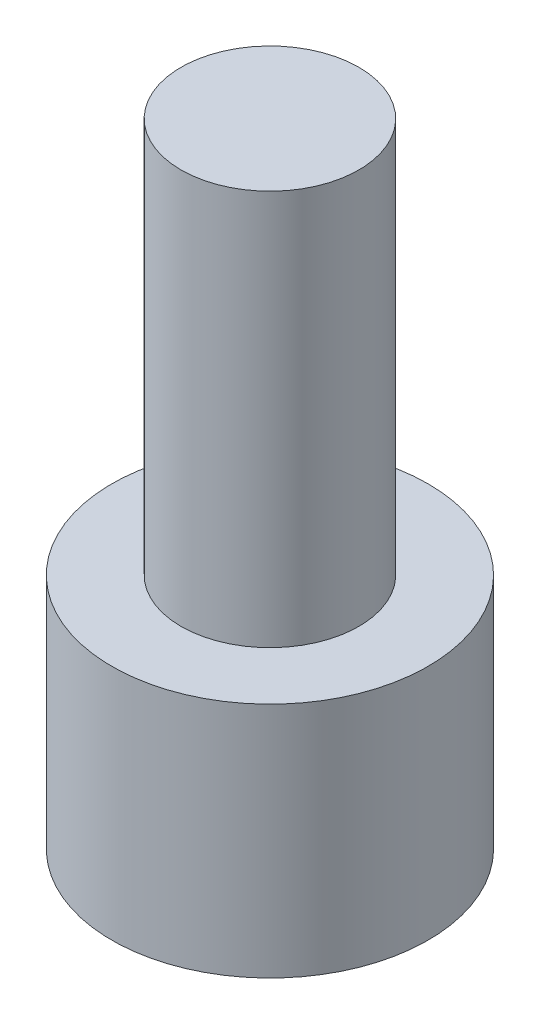
ISO-10303-21;
HEADER;
FILE_DESCRIPTION(('STEP AP214'),'2;1');
FILE_NAME('part.step','',(''),(''),'','','');
FILE_SCHEMA(('AUTOMOTIVE_DESIGN { 1 0 10303 214 1 1 1 1 }'));
ENDSEC;
DATA;
#1=APPLICATION_CONTEXT('core data for automotive mechanical design processes');
#2=APPLICATION_PROTOCOL_DEFINITION('international standard','automotive_design',2000,#1);
#3=PRODUCT_CONTEXT('',#1,'mechanical');
#4=PRODUCT('Part','Part','',(#3));
#5=PRODUCT_RELATED_PRODUCT_CATEGORY('part','',(#4));
#6=PRODUCT_DEFINITION_FORMATION('','',#4);
#7=PRODUCT_DEFINITION_CONTEXT('part definition',#1,'design');
#8=PRODUCT_DEFINITION('design','',#6,#7);
#9=PRODUCT_DEFINITION_SHAPE('','',#8);
#10=(LENGTH_UNIT() NAMED_UNIT(*) SI_UNIT(.MILLI.,.METRE.));
#11=(NAMED_UNIT(*) PLANE_ANGLE_UNIT() SI_UNIT($,.RADIAN.));
#12=(NAMED_UNIT(*) SI_UNIT($,.STERADIAN.) SOLID_ANGLE_UNIT());
#13=UNCERTAINTY_MEASURE_WITH_UNIT(LENGTH_MEASURE(1.E-05),#10,'distance_accuracy_value','');
#14=(GEOMETRIC_REPRESENTATION_CONTEXT(3) GLOBAL_UNCERTAINTY_ASSIGNED_CONTEXT((#13)) GLOBAL_UNIT_ASSIGNED_CONTEXT((#10,
#11,#12)) REPRESENTATION_CONTEXT('',''));
#15=CARTESIAN_POINT('',(0.,0.,0.));
#16=DIRECTION('',(0.,0.,1.));
#17=DIRECTION('',(1.,0.,0.));
#18=AXIS2_PLACEMENT_3D('',#15,#16,#17);
#19=CARTESIAN_POINT('',(0.,10.,0.));
#20=DIRECTION('',(0.,-1.,0.));
#21=DIRECTION('',(0.,0.,-1.));
#22=AXIS2_PLACEMENT_3D('',#19,#20,#21);
#23=CYLINDRICAL_SURFACE('',#22,2.25);
#24=CARTESIAN_POINT('',(0.,10.,0.));
#25=DIRECTION('',(0.,1.,0.));
#26=DIRECTION('',(0.,0.,1.));
#27=AXIS2_PLACEMENT_3D('',#24,#25,#26);
#28=CIRCLE('',#27,2.25);
#29=CARTESIAN_POINT('',(0.,10.,2.25));
#30=VERTEX_POINT('',#29);
#31=EDGE_CURVE('E10',#30,#30,#28,.T.);
#32=ORIENTED_EDGE('',*,*,#31,.F.);
#33=EDGE_LOOP('',(#32));
#34=FACE_BOUND('',#33,.T.);
#35=CARTESIAN_POINT('',(0.,0.,0.));
#36=DIRECTION('',(0.,1.,0.));
#37=DIRECTION('',(0.,0.,1.));
#38=AXIS2_PLACEMENT_3D('',#35,#36,#37);
#39=CIRCLE('',#38,2.25);
#40=CARTESIAN_POINT('',(0.,0.,2.25));
#41=VERTEX_POINT('',#40);
#42=EDGE_CURVE('E38',#41,#41,#39,.T.);
#43=ORIENTED_EDGE('',*,*,#42,.T.);
#44=EDGE_LOOP('',(#43));
#45=FACE_BOUND('',#44,.T.);
#46=ADVANCED_FACE('F35',(#34,#45),#23,.T.);
#47=CARTESIAN_POINT('',(0.,10.,0.));
#48=DIRECTION('',(0.,1.,0.));
#49=DIRECTION('',(0.,0.,1.));
#50=AXIS2_PLACEMENT_3D('',#47,#48,#49);
#51=PLANE('',#50);
#52=ORIENTED_EDGE('',*,*,#31,.T.);
#53=EDGE_LOOP('',(#52));
#54=FACE_BOUND('',#53,.T.);
#55=ADVANCED_FACE('F77',(#54),#51,.T.);
#56=CARTESIAN_POINT('',(0.,-6.,0.));
#57=DIRECTION('',(0.,1.,0.));
#58=DIRECTION('',(0.,0.,1.));
#59=AXIS2_PLACEMENT_3D('',#56,#57,#58);
#60=CYLINDRICAL_SURFACE('',#59,4.);
#61=CARTESIAN_POINT('',(0.,-6.,0.));
#62=DIRECTION('',(0.,-1.,0.));
#63=DIRECTION('',(0.,0.,-1.));
#64=AXIS2_PLACEMENT_3D('',#61,#62,#63);
#65=CIRCLE('',#64,4.);
#66=CARTESIAN_POINT('',(0.,-6.,-4.));
#67=VERTEX_POINT('',#66);
#68=EDGE_CURVE('E45',#67,#67,#65,.T.);
#69=ORIENTED_EDGE('',*,*,#68,.F.);
#70=EDGE_LOOP('',(#69));
#71=FACE_BOUND('',#70,.T.);
#72=CARTESIAN_POINT('',(0.,0.,0.));
#73=DIRECTION('',(0.,-1.,0.));
#74=DIRECTION('',(0.,0.,-1.));
#75=AXIS2_PLACEMENT_3D('',#72,#73,#74);
#76=CIRCLE('',#75,4.);
#77=CARTESIAN_POINT('',(0.,0.,-4.));
#78=VERTEX_POINT('',#77);
#79=EDGE_CURVE('E47',#78,#78,#76,.T.);
#80=ORIENTED_EDGE('',*,*,#79,.T.);
#81=EDGE_LOOP('',(#80));
#82=FACE_BOUND('',#81,.T.);
#83=ADVANCED_FACE('F71',(#71,#82),#60,.T.);
#84=CARTESIAN_POINT('',(0.,-6.,0.));
#85=DIRECTION('',(0.,-1.,0.));
#86=DIRECTION('',(0.,0.,-1.));
#87=AXIS2_PLACEMENT_3D('',#84,#85,#86);
#88=PLANE('',#87);
#89=CARTESIAN_POINT('',(0.,-6.,0.));
#90=DIRECTION('',(0.,-1.,0.));
#91=DIRECTION('',(0.,0.,-1.));
#92=AXIS2_PLACEMENT_3D('',#89,#90,#91);
#93=CIRCLE('',#92,2.25);
#94=CARTESIAN_POINT('',(0.,-6.,-2.25));
#95=VERTEX_POINT('',#94);
#96=EDGE_CURVE('E53',#95,#95,#93,.T.);
#97=ORIENTED_EDGE('',*,*,#96,.F.);
#98=EDGE_LOOP('',(#97));
#99=FACE_BOUND('',#98,.T.);
#100=ORIENTED_EDGE('',*,*,#68,.T.);
#101=EDGE_LOOP('',(#100));
#102=FACE_BOUND('',#101,.T.);
#103=ADVANCED_FACE('F68',(#99,#102),#88,.T.);
#104=CARTESIAN_POINT('',(0.,0.,0.));
#105=DIRECTION('',(0.,-1.,0.));
#106=DIRECTION('',(0.,0.,-1.));
#107=AXIS2_PLACEMENT_3D('',#104,#105,#106);
#108=PLANE('',#107);
#109=ORIENTED_EDGE('',*,*,#42,.F.);
#110=EDGE_LOOP('',(#109));
#111=FACE_BOUND('',#110,.T.);
#112=ORIENTED_EDGE('',*,*,#79,.F.);
#113=EDGE_LOOP('',(#112));
#114=FACE_BOUND('',#113,.T.);
#115=ADVANCED_FACE('F64',(#111,#114),#108,.F.);
#116=CARTESIAN_POINT('',(0.,-4.,0.));
#117=DIRECTION('',(0.,-1.,0.));
#118=DIRECTION('',(0.,0.,-1.));
#119=AXIS2_PLACEMENT_3D('',#116,#117,#118);
#120=CYLINDRICAL_SURFACE('',#119,2.25);
#121=CARTESIAN_POINT('',(0.,-4.,0.));
#122=DIRECTION('',(0.,-1.,0.));
#123=DIRECTION('',(0.,0.,-1.));
#124=AXIS2_PLACEMENT_3D('',#121,#122,#123);
#125=CIRCLE('',#124,2.25);
#126=CARTESIAN_POINT('',(0.,-4.,-2.25));
#127=VERTEX_POINT('',#126);
#128=EDGE_CURVE('E50',#127,#127,#125,.T.);
#129=ORIENTED_EDGE('',*,*,#128,.F.);
#130=EDGE_LOOP('',(#129));
#131=FACE_BOUND('',#130,.T.);
#132=ORIENTED_EDGE('',*,*,#96,.T.);
#133=EDGE_LOOP('',(#132));
#134=FACE_BOUND('',#133,.T.);
#135=ADVANCED_FACE('F61',(#131,#134),#120,.F.);
#136=CARTESIAN_POINT('',(0.,-4.,0.));
#137=DIRECTION('',(0.,-1.,0.));
#138=DIRECTION('',(0.,0.,-1.));
#139=AXIS2_PLACEMENT_3D('',#136,#137,#138);
#140=PLANE('',#139);
#141=ORIENTED_EDGE('',*,*,#128,.T.);
#142=EDGE_LOOP('',(#141));
#143=FACE_BOUND('',#142,.T.);
#144=ADVANCED_FACE('F59',(#143),#140,.T.);
#145=CLOSED_SHELL('',(#46,#55,#83,#103,#115,#135,#144));
#146=MANIFOLD_SOLID_BREP('B2',#145);
#147=ADVANCED_BREP_SHAPE_REPRESENTATION('',(#18,#146),#14);
#148=SHAPE_DEFINITION_REPRESENTATION(#9,#147);
ENDSEC;
END-ISO-10303-21;
